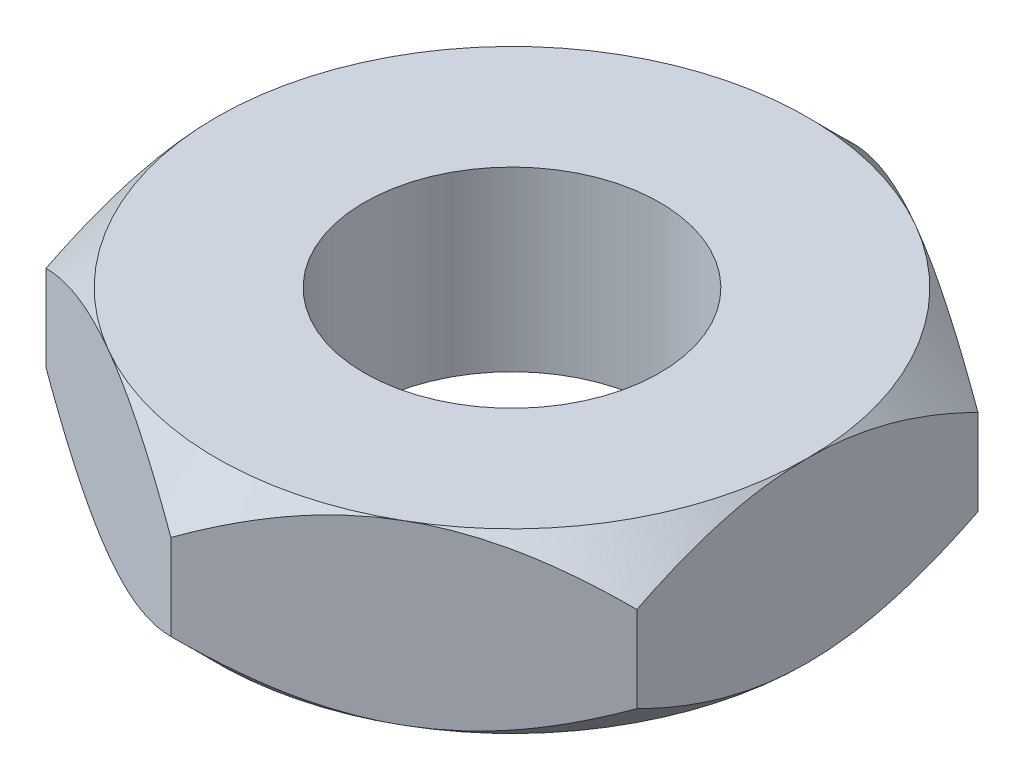
ISO-10303-21;
HEADER;
FILE_DESCRIPTION(('STEP AP214'),'2;1');
FILE_NAME('part.step','',(''),(''),'','','');
FILE_SCHEMA(('AUTOMOTIVE_DESIGN { 1 0 10303 214 1 1 1 1 }'));
ENDSEC;
DATA;
#1=APPLICATION_CONTEXT('core data for automotive mechanical design processes');
#2=APPLICATION_PROTOCOL_DEFINITION('international standard','automotive_design',2000,#1);
#3=PRODUCT_CONTEXT('',#1,'mechanical');
#4=PRODUCT('Part','Part','',(#3));
#5=PRODUCT_RELATED_PRODUCT_CATEGORY('part','',(#4));
#6=PRODUCT_DEFINITION_FORMATION('','',#4);
#7=PRODUCT_DEFINITION_CONTEXT('part definition',#1,'design');
#8=PRODUCT_DEFINITION('design','',#6,#7);
#9=PRODUCT_DEFINITION_SHAPE('','',#8);
#10=(LENGTH_UNIT() NAMED_UNIT(*) SI_UNIT(.MILLI.,.METRE.));
#11=(NAMED_UNIT(*) PLANE_ANGLE_UNIT() SI_UNIT($,.RADIAN.));
#12=(NAMED_UNIT(*) SI_UNIT($,.STERADIAN.) SOLID_ANGLE_UNIT());
#13=UNCERTAINTY_MEASURE_WITH_UNIT(LENGTH_MEASURE(1.E-05),#10,'distance_accuracy_value','');
#14=(GEOMETRIC_REPRESENTATION_CONTEXT(3) GLOBAL_UNCERTAINTY_ASSIGNED_CONTEXT((#13)) GLOBAL_UNIT_ASSIGNED_CONTEXT((#10,
#11,#12)) REPRESENTATION_CONTEXT('',''));
#15=CARTESIAN_POINT('',(0.,0.,0.));
#16=DIRECTION('',(0.,0.,1.));
#17=DIRECTION('',(1.,0.,0.));
#18=AXIS2_PLACEMENT_3D('',#15,#16,#17);
#19=CARTESIAN_POINT('',(0.,-0.6,0.));
#20=DIRECTION('',(0.,1.,0.));
#21=DIRECTION('',(0.,0.,1.));
#22=AXIS2_PLACEMENT_3D('',#19,#20,#21);
#23=PLANE('',#22);
#24=CARTESIAN_POINT('',(0.,-0.6,0.));
#25=DIRECTION('',(0.,1.,0.));
#26=DIRECTION('',(0.,0.,1.));
#27=AXIS2_PLACEMENT_3D('',#24,#25,#26);
#28=CIRCLE('',#27,1.);
#29=CARTESIAN_POINT('',(0.,-0.6,1.));
#30=VERTEX_POINT('',#29);
#31=EDGE_CURVE('E251',#30,#30,#28,.T.);
#32=ORIENTED_EDGE('',*,*,#31,.T.);
#33=EDGE_LOOP('',(#32));
#34=FACE_BOUND('',#33,.T.);
#35=CARTESIAN_POINT('',(0.,-0.6,0.));
#36=DIRECTION('',(0.,1.,0.));
#37=DIRECTION('',(-1.,0.,0.));
#38=AXIS2_PLACEMENT_3D('',#35,#36,#37);
#39=CIRCLE('',#38,2.);
#40=CARTESIAN_POINT('',(-1.,-0.6,1.73205080756888));
#41=VERTEX_POINT('',#40);
#42=CARTESIAN_POINT('',(0.999999999999999,-0.6,1.73205080756888));
#43=VERTEX_POINT('',#42);
#44=EDGE_CURVE('E164',#41,#43,#39,.T.);
#45=ORIENTED_EDGE('',*,*,#44,.F.);
#46=CARTESIAN_POINT('',(-2.,-0.6,0.));
#47=VERTEX_POINT('',#46);
#48=EDGE_CURVE('E148',#47,#41,#39,.T.);
#49=ORIENTED_EDGE('',*,*,#48,.F.);
#50=CARTESIAN_POINT('',(-1.,-0.6,-1.73205080756888));
#51=VERTEX_POINT('',#50);
#52=EDGE_CURVE('E135',#51,#47,#39,.T.);
#53=ORIENTED_EDGE('',*,*,#52,.F.);
#54=CARTESIAN_POINT('',(1.,-0.6,-1.73205080756888));
#55=VERTEX_POINT('',#54);
#56=EDGE_CURVE('E146',#55,#51,#39,.T.);
#57=ORIENTED_EDGE('',*,*,#56,.F.);
#58=CARTESIAN_POINT('',(2.,-0.6,0.));
#59=VERTEX_POINT('',#58);
#60=EDGE_CURVE('E59',#59,#55,#39,.T.);
#61=ORIENTED_EDGE('',*,*,#60,.F.);
#62=EDGE_CURVE('E169',#43,#59,#39,.T.);
#63=ORIENTED_EDGE('',*,*,#62,.F.);
#64=EDGE_LOOP('',(#45,#49,#53,#57,#61,#63));
#65=FACE_BOUND('',#64,.T.);
#66=ADVANCED_FACE('F37',(#34,#65),#23,.F.);
#67=CARTESIAN_POINT('',(0.,0.6,0.));
#68=DIRECTION('',(0.,1.,0.));
#69=DIRECTION('',(0.,0.,1.));
#70=AXIS2_PLACEMENT_3D('',#67,#68,#69);
#71=PLANE('',#70);
#72=CARTESIAN_POINT('',(0.,0.6,0.));
#73=DIRECTION('',(0.,1.,0.));
#74=DIRECTION('',(0.,0.,1.));
#75=AXIS2_PLACEMENT_3D('',#72,#73,#74);
#76=CIRCLE('',#75,1.);
#77=CARTESIAN_POINT('',(0.,0.6,1.));
#78=VERTEX_POINT('',#77);
#79=EDGE_CURVE('E247',#78,#78,#76,.T.);
#80=ORIENTED_EDGE('',*,*,#79,.F.);
#81=EDGE_LOOP('',(#80));
#82=FACE_BOUND('',#81,.T.);
#83=CARTESIAN_POINT('',(0.,0.6,0.));
#84=DIRECTION('',(0.,1.,0.));
#85=DIRECTION('',(-1.,0.,0.));
#86=AXIS2_PLACEMENT_3D('',#83,#84,#85);
#87=CIRCLE('',#86,2.);
#88=CARTESIAN_POINT('',(-2.,0.6,0.));
#89=VERTEX_POINT('',#88);
#90=CARTESIAN_POINT('',(-1.,0.6,1.73205080756888));
#91=VERTEX_POINT('',#90);
#92=EDGE_CURVE('E302',#89,#91,#87,.T.);
#93=ORIENTED_EDGE('',*,*,#92,.T.);
#94=CARTESIAN_POINT('',(0.999999999999999,0.6,1.73205080756888));
#95=VERTEX_POINT('',#94);
#96=EDGE_CURVE('E304',#91,#95,#87,.T.);
#97=ORIENTED_EDGE('',*,*,#96,.T.);
#98=CARTESIAN_POINT('',(2.,0.6,0.));
#99=VERTEX_POINT('',#98);
#100=EDGE_CURVE('E314',#95,#99,#87,.T.);
#101=ORIENTED_EDGE('',*,*,#100,.T.);
#102=CARTESIAN_POINT('',(1.,0.6,-1.73205080756888));
#103=VERTEX_POINT('',#102);
#104=EDGE_CURVE('E317',#99,#103,#87,.T.);
#105=ORIENTED_EDGE('',*,*,#104,.T.);
#106=CARTESIAN_POINT('',(-1.,0.6,-1.73205080756888));
#107=VERTEX_POINT('',#106);
#108=EDGE_CURVE('E315',#103,#107,#87,.T.);
#109=ORIENTED_EDGE('',*,*,#108,.T.);
#110=EDGE_CURVE('E306',#107,#89,#87,.T.);
#111=ORIENTED_EDGE('',*,*,#110,.T.);
#112=EDGE_LOOP('',(#93,#97,#101,#105,#109,#111));
#113=FACE_BOUND('',#112,.T.);
#114=ADVANCED_FACE('F283',(#82,#113),#71,.T.);
#115=CARTESIAN_POINT('',(2.,0.6,-1.15470053837925));
#116=DIRECTION('',(-0.5,0.,0.866025403784439));
#117=DIRECTION('',(0.866025403784439,0.,0.5));
#118=AXIS2_PLACEMENT_3D('',#115,#116,#117);
#119=PLANE('',#118);
#120=DIRECTION('',(0.,-1.,0.));
#121=VECTOR('',#120,1.);
#122=CARTESIAN_POINT('',(2.,0.6,-1.15470053837925));
#123=LINE('',#122,#121);
#124=CARTESIAN_POINT('',(2.,0.290598923241498,-1.15470053837925));
#125=VERTEX_POINT('',#124);
#126=CARTESIAN_POINT('',(2.,-0.290598923241498,-1.15470053837925));
#127=VERTEX_POINT('',#126);
#128=EDGE_CURVE('E250',#125,#127,#123,.T.);
#129=ORIENTED_EDGE('',*,*,#128,.T.);
#130=CARTESIAN_POINT('',(2.0002,-0.290483444527839,-1.15458506832542));
#131=CARTESIAN_POINT('',(1.93144696596929,-0.330145833015907,-1.19427965103065));
#132=CARTESIAN_POINT('',(1.86154425786449,-0.367478940957337,-1.23463799837204));
#133=CARTESIAN_POINT('',(1.71900475544956,-0.435835238105355,-1.31693321846145));
#134=CARTESIAN_POINT('',(1.64635440243464,-0.466820389504277,-1.35887791933134));
#135=CARTESIAN_POINT('',(1.49985839894603,-0.519898706697355,-1.44345742638069));
#136=CARTESIAN_POINT('',(1.42605006475371,-0.542125296064887,-1.48607068799507));
#137=CARTESIAN_POINT('',(1.27680836816474,-0.576370106566418,-1.57223542169503));
#138=CARTESIAN_POINT('',(1.20137956608185,-0.588413894097364,-1.61578426088223));
#139=CARTESIAN_POINT('',(1.07138449932892,-0.599280411335927,-1.69083694766536));
#140=CARTESIAN_POINT('',(1.01698621602989,-0.600889169631528,-1.72224381117151));
#141=CARTESIAN_POINT('',(0.90827854448031,-0.598180045642787,-1.78500621460364));
#142=CARTESIAN_POINT('',(0.853969194078665,-0.593860085483524,-1.81636173267754));
#143=CARTESIAN_POINT('',(0.745863272410666,-0.579539355831593,-1.87877671565355));
#144=CARTESIAN_POINT('',(0.692067343445212,-0.569532230479493,-1.90983580972306));
#145=CARTESIAN_POINT('',(0.585405737694431,-0.54438649299184,-1.97141691651547));
#146=CARTESIAN_POINT('',(0.532539989929292,-0.52924827419926,-2.00193897021859));
#147=CARTESIAN_POINT('',(0.39712026691016,-0.484304419812309,-2.08012358375727));
#148=CARTESIAN_POINT('',(0.315406165150525,-0.451110083815683,-2.12730124240478));
#149=CARTESIAN_POINT('',(0.195252962742199,-0.395073100070129,-2.19667172615922));
#150=CARTESIAN_POINT('',(0.155657147890824,-0.375384220294558,-2.21953238052245));
#151=CARTESIAN_POINT('',(0.0771990411121284,-0.334211604876626,-2.26483018959124));
#152=CARTESIAN_POINT('',(0.03833631640626,-0.31272897159025,-2.28726759416161));
#153=CARTESIAN_POINT('',(-0.000199999999999924,-0.290483444527838,-2.30951654681234));
#154=B_SPLINE_CURVE_WITH_KNOTS('',3,(#130,#131,#132,#133,#134,#135,#136,#137,#138,#139,#140,
#141,#142,#143,#144,#145,#146,#147,#148,#149,#150,#151,#152,#153),.UNSPECIFIED.,.F.,.F.,(4,2,2,
2,2,2,2,2,2,2,2,4),(0.,0.266420613771062,0.534393751523386,0.798110374376911,1.06116288956936,
1.24939906803721,1.43770123566247,1.62621426093931,1.81471283831912,2.11415604834144,
2.2634717071779,2.41269626969771),.UNSPECIFIED.);
#155=EDGE_CURVE('E316',#127,#55,#154,.T.);
#156=ORIENTED_EDGE('',*,*,#155,.T.);
#157=CARTESIAN_POINT('',(0.,-0.290598923241497,-2.3094010767585));
#158=VERTEX_POINT('',#157);
#159=EDGE_CURVE('E211',#55,#158,#154,.T.);
#160=ORIENTED_EDGE('',*,*,#159,.T.);
#161=DIRECTION('',(0.,-1.,0.));
#162=VECTOR('',#161,1.);
#163=CARTESIAN_POINT('',(0.,0.6,-2.3094010767585));
#164=LINE('',#163,#162);
#165=CARTESIAN_POINT('',(0.,0.290598923241497,-2.3094010767585));
#166=VERTEX_POINT('',#165);
#167=EDGE_CURVE('E265',#166,#158,#164,.T.);
#168=ORIENTED_EDGE('',*,*,#167,.F.);
#169=CARTESIAN_POINT('',(-0.0002,0.290483444527838,-2.30951654681234));
#170=CARTESIAN_POINT('',(0.0685530340307054,0.330145833015905,-2.26982196410711));
#171=CARTESIAN_POINT('',(0.138455742135511,0.367478940957335,-2.22946361676572));
#172=CARTESIAN_POINT('',(0.280995244550436,0.435835238105354,-2.14716839667631));
#173=CARTESIAN_POINT('',(0.353645597565357,0.466820389504277,-2.10522369580642));
#174=CARTESIAN_POINT('',(0.50014160105397,0.519898706697355,-2.02064418875706));
#175=CARTESIAN_POINT('',(0.573949935246293,0.542125296064887,-1.97803092714269));
#176=CARTESIAN_POINT('',(0.723191631835262,0.576370106566417,-1.89186619344273));
#177=CARTESIAN_POINT('',(0.79862043391815,0.588413894097364,-1.84831735425552));
#178=CARTESIAN_POINT('',(0.928615500671077,0.599280411335927,-1.7732646674724));
#179=CARTESIAN_POINT('',(0.983013783970106,0.600889169631528,-1.74185780396625));
#180=CARTESIAN_POINT('',(1.09172145551969,0.598180045642787,-1.67909540053412));
#181=CARTESIAN_POINT('',(1.14603080592134,0.593860085483524,-1.64773988246022));
#182=CARTESIAN_POINT('',(1.25413672758933,0.579539355831593,-1.58532489948421));
#183=CARTESIAN_POINT('',(1.30793265655479,0.569532230479493,-1.55426580541469));
#184=CARTESIAN_POINT('',(1.41459426230557,0.54438649299184,-1.49268469862228));
#185=CARTESIAN_POINT('',(1.46746001007071,0.52924827419926,-1.46216264491917));
#186=CARTESIAN_POINT('',(1.60287973308984,0.48430441981231,-1.38397803138049));
#187=CARTESIAN_POINT('',(1.68459383484948,0.451110083815684,-1.33680037273298));
#188=CARTESIAN_POINT('',(1.8047470372578,0.39507310007013,-1.26742988897853));
#189=CARTESIAN_POINT('',(1.84434285210917,0.375384220294559,-1.24456923461531));
#190=CARTESIAN_POINT('',(1.92280095888787,0.334211604876628,-1.19927142554652));
#191=CARTESIAN_POINT('',(1.96166368359374,0.312728971590252,-1.17683402097615));
#192=CARTESIAN_POINT('',(2.0002,0.290483444527839,-1.15458506832542));
#193=B_SPLINE_CURVE_WITH_KNOTS('',3,(#169,#170,#171,#172,#173,#174,#175,#176,#177,#178,#179,
#180,#181,#182,#183,#184,#185,#186,#187,#188,#189,#190,#191,#192),.UNSPECIFIED.,.F.,.F.,(4,2,2,
2,2,2,2,2,2,2,2,4),(0.,0.266420613771063,0.534393751523387,0.798110374376912,1.06116288956936,
1.24939906803721,1.43770123566247,1.62621426093931,1.81471283831913,2.11415604834144,
2.2634717071779,2.41269626969771),.UNSPECIFIED.);
#194=EDGE_CURVE('E488',#166,#103,#193,.T.);
#195=ORIENTED_EDGE('',*,*,#194,.T.);
#196=EDGE_CURVE('E311',#103,#125,#193,.T.);
#197=ORIENTED_EDGE('',*,*,#196,.T.);
#198=EDGE_LOOP('',(#129,#156,#160,#168,#195,#197));
#199=FACE_BOUND('',#198,.T.);
#200=ADVANCED_FACE('F39',(#199),#119,.F.);
#201=CARTESIAN_POINT('',(0.,0.6,-2.3094010767585));
#202=DIRECTION('',(0.5,0.,0.866025403784439));
#203=DIRECTION('',(0.866025403784439,0.,-0.5));
#204=AXIS2_PLACEMENT_3D('',#201,#202,#203);
#205=PLANE('',#204);
#206=ORIENTED_EDGE('',*,*,#167,.T.);
#207=CARTESIAN_POINT('',(0.000200000000000061,-0.290483444527838,-2.30951654681234));
#208=CARTESIAN_POINT('',(-0.0685530340307052,-0.330145833015905,-2.26982196410711));
#209=CARTESIAN_POINT('',(-0.138455742135511,-0.367478940957336,-2.22946361676572));
#210=CARTESIAN_POINT('',(-0.280995244550436,-0.435835238105354,-2.14716839667631));
#211=CARTESIAN_POINT('',(-0.353645597565358,-0.466820389504277,-2.10522369580642));
#212=CARTESIAN_POINT('',(-0.50014160105397,-0.519898706697355,-2.02064418875706));
#213=CARTESIAN_POINT('',(-0.573949935246293,-0.542125296064887,-1.97803092714269));
#214=CARTESIAN_POINT('',(-0.723191631835262,-0.576370106566417,-1.89186619344273));
#215=CARTESIAN_POINT('',(-0.79862043391815,-0.588413894097363,-1.84831735425552));
#216=CARTESIAN_POINT('',(-0.928615500671077,-0.599280411335926,-1.7732646674724));
#217=CARTESIAN_POINT('',(-0.983013783970106,-0.600889169631528,-1.74185780396625));
#218=CARTESIAN_POINT('',(-1.09172145551969,-0.598180045642787,-1.67909540053412));
#219=CARTESIAN_POINT('',(-1.14603080592134,-0.593860085483524,-1.64773988246022));
#220=CARTESIAN_POINT('',(-1.25413672758933,-0.579539355831593,-1.58532489948421));
#221=CARTESIAN_POINT('',(-1.30793265655479,-0.569532230479493,-1.55426580541469));
#222=CARTESIAN_POINT('',(-1.41459426230557,-0.54438649299184,-1.49268469862228));
#223=CARTESIAN_POINT('',(-1.46746001007071,-0.52924827419926,-1.46216264491917));
#224=CARTESIAN_POINT('',(-1.60287973308984,-0.484304419812309,-1.38397803138049));
#225=CARTESIAN_POINT('',(-1.68459383484948,-0.451110083815683,-1.33680037273298));
#226=CARTESIAN_POINT('',(-1.8047470372578,-0.395073100070128,-1.26742988897853));
#227=CARTESIAN_POINT('',(-1.84434285210918,-0.375384220294558,-1.24456923461531));
#228=CARTESIAN_POINT('',(-1.92280095888787,-0.334211604876626,-1.19927142554652));
#229=CARTESIAN_POINT('',(-1.96166368359374,-0.312728971590251,-1.17683402097615));
#230=CARTESIAN_POINT('',(-2.0002,-0.290483444527837,-1.15458506832541));
#231=B_SPLINE_CURVE_WITH_KNOTS('',3,(#207,#208,#209,#210,#211,#212,#213,#214,#215,#216,#217,
#218,#219,#220,#221,#222,#223,#224,#225,#226,#227,#228,#229,#230),.UNSPECIFIED.,.F.,.F.,(4,2,2,
2,2,2,2,2,2,2,2,4),(0.,0.266420613771063,0.534393751523387,0.798110374376913,1.06116288956936,
1.24939906803721,1.43770123566247,1.62621426093931,1.81471283831913,2.11415604834144,
2.2634717071779,2.41269626969771),.UNSPECIFIED.);
#232=EDGE_CURVE('E210',#158,#51,#231,.T.);
#233=ORIENTED_EDGE('',*,*,#232,.T.);
#234=CARTESIAN_POINT('',(-2.,-0.290598923241496,-1.15470053837925));
#235=VERTEX_POINT('',#234);
#236=EDGE_CURVE('E141',#51,#235,#231,.T.);
#237=ORIENTED_EDGE('',*,*,#236,.T.);
#238=DIRECTION('',(0.,-1.,0.));
#239=VECTOR('',#238,1.);
#240=CARTESIAN_POINT('',(-2.,0.6,-1.15470053837925));
#241=LINE('',#240,#239);
#242=CARTESIAN_POINT('',(-2.,0.290598923241496,-1.15470053837925));
#243=VERTEX_POINT('',#242);
#244=EDGE_CURVE('E162',#243,#235,#241,.T.);
#245=ORIENTED_EDGE('',*,*,#244,.F.);
#246=CARTESIAN_POINT('',(-2.0002,0.290483444527837,-1.15458506832541));
#247=CARTESIAN_POINT('',(-1.9314469659693,0.330145833015905,-1.19427965103065));
#248=CARTESIAN_POINT('',(-1.86154425786449,0.367478940957335,-1.23463799837204));
#249=CARTESIAN_POINT('',(-1.71900475544957,0.435835238105354,-1.31693321846145));
#250=CARTESIAN_POINT('',(-1.64635440243464,0.466820389504277,-1.35887791933134));
#251=CARTESIAN_POINT('',(-1.49985839894603,0.519898706697355,-1.44345742638069));
#252=CARTESIAN_POINT('',(-1.42605006475371,0.542125296064887,-1.48607068799507));
#253=CARTESIAN_POINT('',(-1.27680836816474,0.576370106566417,-1.57223542169503));
#254=CARTESIAN_POINT('',(-1.20137956608185,0.588413894097363,-1.61578426088223));
#255=CARTESIAN_POINT('',(-1.07138449932892,0.599280411335926,-1.69083694766536));
#256=CARTESIAN_POINT('',(-1.01698621602989,0.600889169631528,-1.72224381117151));
#257=CARTESIAN_POINT('',(-0.908278544480309,0.598180045642787,-1.78500621460364));
#258=CARTESIAN_POINT('',(-0.853969194078664,0.593860085483524,-1.81636173267754));
#259=CARTESIAN_POINT('',(-0.745863272410665,0.579539355831593,-1.87877671565355));
#260=CARTESIAN_POINT('',(-0.692067343445211,0.569532230479492,-1.90983580972306));
#261=CARTESIAN_POINT('',(-0.58540573769443,0.54438649299184,-1.97141691651547));
#262=CARTESIAN_POINT('',(-0.532539989929292,0.529248274199259,-2.00193897021859));
#263=CARTESIAN_POINT('',(-0.397120266910159,0.484304419812309,-2.08012358375727));
#264=CARTESIAN_POINT('',(-0.315406165150524,0.451110083815683,-2.12730124240478));
#265=CARTESIAN_POINT('',(-0.195252962742199,0.395073100070129,-2.19667172615922));
#266=CARTESIAN_POINT('',(-0.155657147890824,0.375384220294558,-2.21953238052245));
#267=CARTESIAN_POINT('',(-0.0771990411121282,0.334211604876626,-2.26483018959124));
#268=CARTESIAN_POINT('',(-0.0383363164062599,0.312728971590251,-2.28726759416161));
#269=CARTESIAN_POINT('',(0.000200000000000082,0.290483444527838,-2.30951654681234));
#270=B_SPLINE_CURVE_WITH_KNOTS('',3,(#246,#247,#248,#249,#250,#251,#252,#253,#254,#255,#256,
#257,#258,#259,#260,#261,#262,#263,#264,#265,#266,#267,#268,#269),.UNSPECIFIED.,.F.,.F.,(4,2,2,
2,2,2,2,2,2,2,2,4),(0.,0.266420613771063,0.534393751523388,0.798110374376913,1.06116288956936,
1.24939906803721,1.43770123566247,1.62621426093931,1.81471283831913,2.11415604834145,
2.26347170717791,2.41269626969771),.UNSPECIFIED.);
#271=EDGE_CURVE('E232',#243,#107,#270,.T.);
#272=ORIENTED_EDGE('',*,*,#271,.T.);
#273=EDGE_CURVE('E224',#107,#166,#270,.T.);
#274=ORIENTED_EDGE('',*,*,#273,.T.);
#275=EDGE_LOOP('',(#206,#233,#237,#245,#272,#274));
#276=FACE_BOUND('',#275,.T.);
#277=ADVANCED_FACE('F217',(#276),#205,.F.);
#278=CARTESIAN_POINT('',(-2.,0.6,-1.15470053837925));
#279=DIRECTION('',(1.,0.,0.));
#280=DIRECTION('',(0.,0.,-1.));
#281=AXIS2_PLACEMENT_3D('',#278,#279,#280);
#282=PLANE('',#281);
#283=ORIENTED_EDGE('',*,*,#244,.T.);
#284=CARTESIAN_POINT('',(-2.,1.44660049892774,-3.51780835150556));
#285=CARTESIAN_POINT('',(-2.,1.35633545480338,-3.4139345116189));
#286=CARTESIAN_POINT('',(-2.,1.26658419325914,-3.30960491746731));
#287=CARTESIAN_POINT('',(-2.,1.0884758173122,-3.09967990012628));
#288=CARTESIAN_POINT('',(-2.,1.00011937533331,-2.99408390713831));
#289=CARTESIAN_POINT('',(-2.,0.823300975600661,-2.77899453825182));
#290=CARTESIAN_POINT('',(-2.,0.734880681292233,-2.66946677903041));
#291=CARTESIAN_POINT('',(-2.,0.560675360874649,-2.44836951178693));
#292=CARTESIAN_POINT('',(-2.,0.474889682970528,-2.33680051983729));
#293=CARTESIAN_POINT('',(-2.,0.306845435256085,-2.11080052612119));
#294=CARTESIAN_POINT('',(-2.,0.224591465017628,-1.99636608210072));
#295=CARTESIAN_POINT('',(-2.,0.065267699624535,-1.76376073489722));
#296=CARTESIAN_POINT('',(-2.,-0.0117978734378841,-1.64558690100855));
#297=CARTESIAN_POINT('',(-2.,-0.157514981910899,-1.40528399303271));
#298=CARTESIAN_POINT('',(-2.,-0.226224060031875,-1.2831902668145));
#299=CARTESIAN_POINT('',(-2.,-0.351589627561633,-1.03297173542377));
#300=CARTESIAN_POINT('',(-2.,-0.408267982746248,-0.904858397765737));
#301=CARTESIAN_POINT('',(-2.,-0.479924443557588,-0.706139491815754));
#302=CARTESIAN_POINT('',(-2.,-0.501747570356134,-0.638014674767849));
#303=CARTESIAN_POINT('',(-2.,-0.539482708360953,-0.500126615146469));
#304=CARTESIAN_POINT('',(-2.,-0.555395660674832,-0.430363635308766));
#305=CARTESIAN_POINT('',(-2.,-0.58024792522351,-0.29004829941457));
#306=CARTESIAN_POINT('',(-2.,-0.589231656434933,-0.219503962378288));
#307=CARTESIAN_POINT('',(-2.,-0.599730623535876,-0.0778570852278749));
#308=CARTESIAN_POINT('',(-2.,-0.601246747381592,-0.00675461248748182));
#309=CARTESIAN_POINT('',(-2.,-0.596687138879518,0.135336116053154));
#310=CARTESIAN_POINT('',(-2.,-0.590596978297835,0.206323898250636));
#311=CARTESIAN_POINT('',(-2.,-0.571270568456236,0.347312907627164));
#312=CARTESIAN_POINT('',(-2.,-0.558032866760425,0.417313931321538));
#313=CARTESIAN_POINT('',(-2.,-0.525177950329333,0.556315109209948));
#314=CARTESIAN_POINT('',(-2.,-0.50551486203721,0.62530422390651));
#315=CARTESIAN_POINT('',(-2.,-0.460894854359054,0.761521897584209));
#316=CARTESIAN_POINT('',(-2.,-0.435937824414415,0.828750419764208));
#317=CARTESIAN_POINT('',(-2.,-0.37604585882821,0.975370133916498));
#318=CARTESIAN_POINT('',(-2.,-0.340116147184565,1.05435137408536));
#319=CARTESIAN_POINT('',(-2.,-0.26345626796406,1.20996895354261));
#320=CARTESIAN_POINT('',(-2.,-0.222723355180706,1.28660392002545));
#321=CARTESIAN_POINT('',(-2.,-0.137520892741945,1.43795765037448));
#322=CARTESIAN_POINT('',(-2.,-0.0930438513745066,1.5126721622257));
#323=CARTESIAN_POINT('',(-2.,-0.00128224073946037,1.66032422213111));
#324=CARTESIAN_POINT('',(-2.,0.0460017767675139,1.73326211546172));
#325=CARTESIAN_POINT('',(-2.,0.14302243934878,1.87805095401499));
#326=CARTESIAN_POINT('',(-2.,0.192770919991859,1.94989393160597));
#327=CARTESIAN_POINT('',(-2.,0.294022529348655,2.09233561836816));
#328=CARTESIAN_POINT('',(-2.,0.345525790481341,2.16293423302477));
#329=CARTESIAN_POINT('',(-2.,0.501996134507537,2.37300510038412));
#330=CARTESIAN_POINT('',(-2.,0.609042896554844,2.51092629513301));
#331=CARTESIAN_POINT('',(-2.,0.836613747941552,2.79612577791961));
#332=CARTESIAN_POINT('',(-2.,0.957482677736062,2.94312626884009));
#333=CARTESIAN_POINT('',(-2.,1.14031475178092,3.16092870375757));
#334=CARTESIAN_POINT('',(-2.,1.20115949273262,3.23267494510208));
#335=CARTESIAN_POINT('',(-2.,1.32345153116278,3.37562403970102));
#336=CARTESIAN_POINT('',(-2.,1.38489868842542,3.44682701285084));
#337=CARTESIAN_POINT('',(-2.,1.44660049892774,3.51780835150555));
#338=B_SPLINE_CURVE_WITH_KNOTS('',3,(#284,#285,#286,#287,#288,#289,#290,#291,#292,#293,#294,
#295,#296,#297,#298,#299,#300,#301,#302,#303,#304,#305,#306,#307,#308,#309,#310,#311,#312,#313,
#314,#315,#316,#317,#318,#319,#320,#321,#322,#323,#324,#325,#326,#327,#328,#329,#330,#331,#332,
#333,#334,#335,#336,#337),.UNSPECIFIED.,.F.,.F.,(4,2,2,2,2,2,2,2,2,2,2,2,2,2,2,2,2,2,2,2,2,2,2,
2,2,2,4),(0.,0.41285013760849,0.825893574338906,1.24815624097891,1.67031358571966,
2.09300501629884,2.51603635798438,2.93596638845078,3.35512653644645,3.56951875894449,
3.78387682801032,3.99684908815923,4.20979602364999,4.42314750881825,4.63654236499184,
4.85149529850702,5.06645272153845,5.32654230351972,5.58678126341899,5.84755391633439,
6.10827547843788,6.37040093518298,6.63254621639994,7.15620490365787,7.72708662506731,
8.0093009816319,8.29145114109918),.UNSPECIFIED.);
#339=EDGE_CURVE('E139',#235,#47,#338,.T.);
#340=ORIENTED_EDGE('',*,*,#339,.T.);
#341=CARTESIAN_POINT('',(-2.,-0.290598923241498,1.15470053837925));
#342=VERTEX_POINT('',#341);
#343=EDGE_CURVE('E152',#47,#342,#338,.T.);
#344=ORIENTED_EDGE('',*,*,#343,.T.);
#345=DIRECTION('',(0.,-1.,0.));
#346=VECTOR('',#345,1.);
#347=CARTESIAN_POINT('',(-2.,0.6,1.15470053837925));
#348=LINE('',#347,#346);
#349=CARTESIAN_POINT('',(-2.,0.290598923241498,1.15470053837925));
#350=VERTEX_POINT('',#349);
#351=EDGE_CURVE('E262',#350,#342,#348,.T.);
#352=ORIENTED_EDGE('',*,*,#351,.F.);
#353=CARTESIAN_POINT('',(-2.,-1.44660049892774,3.51780835150555));
#354=CARTESIAN_POINT('',(-2.,-1.35633545480338,3.4139345116189));
#355=CARTESIAN_POINT('',(-2.,-1.26658419325913,3.30960491746731));
#356=CARTESIAN_POINT('',(-2.,-1.0884758173122,3.09967990012628));
#357=CARTESIAN_POINT('',(-2.,-1.00011937533331,2.99408390713831));
#358=CARTESIAN_POINT('',(-2.,-0.823300975600659,2.77899453825182));
#359=CARTESIAN_POINT('',(-2.,-0.734880681292232,2.6694667790304));
#360=CARTESIAN_POINT('',(-2.,-0.560675360874648,2.44836951178693));
#361=CARTESIAN_POINT('',(-2.,-0.474889682970527,2.33680051983729));
#362=CARTESIAN_POINT('',(-2.,-0.306845435256083,2.11080052612119));
#363=CARTESIAN_POINT('',(-2.,-0.224591465017627,1.99636608210072));
#364=CARTESIAN_POINT('',(-2.,-0.0652676996245338,1.76376073489722));
#365=CARTESIAN_POINT('',(-2.,0.0117978734378852,1.64558690100854));
#366=CARTESIAN_POINT('',(-2.,0.1575149819109,1.40528399303271));
#367=CARTESIAN_POINT('',(-2.,0.226224060031876,1.2831902668145));
#368=CARTESIAN_POINT('',(-2.,0.351589627561633,1.03297173542377));
#369=CARTESIAN_POINT('',(-2.,0.408267982746248,0.904858397765737));
#370=CARTESIAN_POINT('',(-2.,0.479924443557589,0.706139491815753));
#371=CARTESIAN_POINT('',(-2.,0.501747570356134,0.638014674767848));
#372=CARTESIAN_POINT('',(-2.,0.539482708360953,0.500126615146468));
#373=CARTESIAN_POINT('',(-2.,0.555395660674832,0.430363635308765));
#374=CARTESIAN_POINT('',(-2.,0.58024792522351,0.290048299414569));
#375=CARTESIAN_POINT('',(-2.,0.589231656434933,0.219503962378287));
#376=CARTESIAN_POINT('',(-2.,0.599730623535877,0.0778570852278741));
#377=CARTESIAN_POINT('',(-2.,0.601246747381592,0.00675461248748099));
#378=CARTESIAN_POINT('',(-2.,0.596687138879518,-0.135336116053155));
#379=CARTESIAN_POINT('',(-2.,0.590596978297835,-0.206323898250637));
#380=CARTESIAN_POINT('',(-2.,0.571270568456236,-0.347312907627165));
#381=CARTESIAN_POINT('',(-2.,0.558032866760425,-0.417313931321539));
#382=CARTESIAN_POINT('',(-2.,0.525177950329333,-0.556315109209949));
#383=CARTESIAN_POINT('',(-2.,0.50551486203721,-0.625304223906511));
#384=CARTESIAN_POINT('',(-2.,0.460894854359054,-0.76152189758421));
#385=CARTESIAN_POINT('',(-2.,0.435937824414414,-0.828750419764209));
#386=CARTESIAN_POINT('',(-2.,0.376045858828209,-0.975370133916499));
#387=CARTESIAN_POINT('',(-2.,0.340116147184565,-1.05435137408537));
#388=CARTESIAN_POINT('',(-2.,0.26345626796406,-1.20996895354261));
#389=CARTESIAN_POINT('',(-2.,0.222723355180706,-1.28660392002545));
#390=CARTESIAN_POINT('',(-2.,0.137520892741944,-1.43795765037448));
#391=CARTESIAN_POINT('',(-2.,0.0930438513745059,-1.5126721622257));
#392=CARTESIAN_POINT('',(-2.,0.00128224073945946,-1.66032422213111));
#393=CARTESIAN_POINT('',(-2.,-0.0460017767675148,-1.73326211546173));
#394=CARTESIAN_POINT('',(-2.,-0.143022439348781,-1.87805095401499));
#395=CARTESIAN_POINT('',(-2.,-0.19277091999186,-1.94989393160597));
#396=CARTESIAN_POINT('',(-2.,-0.294022529348656,-2.09233561836816));
#397=CARTESIAN_POINT('',(-2.,-0.345525790481342,-2.16293423302478));
#398=CARTESIAN_POINT('',(-2.,-0.501996134507539,-2.37300510038413));
#399=CARTESIAN_POINT('',(-2.,-0.609042896554846,-2.51092629513301));
#400=CARTESIAN_POINT('',(-2.,-0.836613747941554,-2.79612577791961));
#401=CARTESIAN_POINT('',(-2.,-0.957482677736064,-2.94312626884009));
#402=CARTESIAN_POINT('',(-2.,-1.14031475178092,-3.16092870375757));
#403=CARTESIAN_POINT('',(-2.,-1.20115949273262,-3.23267494510208));
#404=CARTESIAN_POINT('',(-2.,-1.32345153116278,-3.37562403970102));
#405=CARTESIAN_POINT('',(-2.,-1.38489868842542,-3.44682701285084));
#406=CARTESIAN_POINT('',(-2.,-1.44660049892774,-3.51780835150556));
#407=B_SPLINE_CURVE_WITH_KNOTS('',3,(#353,#354,#355,#356,#357,#358,#359,#360,#361,#362,#363,
#364,#365,#366,#367,#368,#369,#370,#371,#372,#373,#374,#375,#376,#377,#378,#379,#380,#381,#382,
#383,#384,#385,#386,#387,#388,#389,#390,#391,#392,#393,#394,#395,#396,#397,#398,#399,#400,#401,
#402,#403,#404,#405,#406),.UNSPECIFIED.,.F.,.F.,(4,2,2,2,2,2,2,2,2,2,2,2,2,2,2,2,2,2,2,2,2,2,2,
2,2,2,4),(0.,0.41285013760849,0.825893574338906,1.2481562409789,1.67031358571966,
2.09300501629884,2.51603635798438,2.93596638845078,3.35512653644645,3.56951875894449,
3.78387682801032,3.99684908815923,4.20979602364999,4.42314750881825,4.63654236499184,
4.85149529850701,5.06645272153845,5.32654230351971,5.58678126341898,5.84755391633439,
6.10827547843788,6.37040093518298,6.63254621639994,7.15620490365787,7.72708662506731,
8.0093009816319,8.29145114109918),.UNSPECIFIED.);
#408=EDGE_CURVE('E245',#350,#89,#407,.T.);
#409=ORIENTED_EDGE('',*,*,#408,.T.);
#410=EDGE_CURVE('E239',#89,#243,#407,.T.);
#411=ORIENTED_EDGE('',*,*,#410,.T.);
#412=EDGE_LOOP('',(#283,#340,#344,#352,#409,#411));
#413=FACE_BOUND('',#412,.T.);
#414=ADVANCED_FACE('F159',(#413),#282,.F.);
#415=CARTESIAN_POINT('',(-2.,0.6,1.15470053837925));
#416=DIRECTION('',(0.5,0.,-0.866025403784438));
#417=DIRECTION('',(-0.866025403784439,0.,-0.5));
#418=AXIS2_PLACEMENT_3D('',#415,#416,#417);
#419=PLANE('',#418);
#420=ORIENTED_EDGE('',*,*,#351,.T.);
#421=CARTESIAN_POINT('',(-2.0002,-0.290483444527838,1.15458506832541));
#422=CARTESIAN_POINT('',(-1.9314469659693,-0.330145833015906,1.19427965103064));
#423=CARTESIAN_POINT('',(-1.86154425786449,-0.367478940957336,1.23463799837204));
#424=CARTESIAN_POINT('',(-1.71900475544957,-0.435835238105355,1.31693321846145));
#425=CARTESIAN_POINT('',(-1.64635440243464,-0.466820389504278,1.35887791933134));
#426=CARTESIAN_POINT('',(-1.49985839894603,-0.519898706697356,1.44345742638069));
#427=CARTESIAN_POINT('',(-1.42605006475371,-0.542125296064888,1.48607068799507));
#428=CARTESIAN_POINT('',(-1.27680836816474,-0.576370106566419,1.57223542169502));
#429=CARTESIAN_POINT('',(-1.20137956608185,-0.588413894097364,1.61578426088223));
#430=CARTESIAN_POINT('',(-1.07138449932892,-0.599280411335928,1.69083694766536));
#431=CARTESIAN_POINT('',(-1.01698621602989,-0.600889169631529,1.7222438111715));
#432=CARTESIAN_POINT('',(-0.90827854448031,-0.598180045642788,1.78500621460363));
#433=CARTESIAN_POINT('',(-0.853969194078665,-0.593860085483526,1.81636173267754));
#434=CARTESIAN_POINT('',(-0.745863272410666,-0.579539355831594,1.87877671565355));
#435=CARTESIAN_POINT('',(-0.692067343445212,-0.569532230479494,1.90983580972306));
#436=CARTESIAN_POINT('',(-0.585405737694432,-0.544386492991842,1.97141691651547));
#437=CARTESIAN_POINT('',(-0.532539989929293,-0.529248274199261,2.00193897021859));
#438=CARTESIAN_POINT('',(-0.39712026691016,-0.484304419812311,2.08012358375727));
#439=CARTESIAN_POINT('',(-0.315406165150525,-0.451110083815685,2.12730124240478));
#440=CARTESIAN_POINT('',(-0.1952529627422,-0.39507310007013,2.19667172615922));
#441=CARTESIAN_POINT('',(-0.155657147890825,-0.37538422029456,2.21953238052245));
#442=CARTESIAN_POINT('',(-0.0771990411121292,-0.334211604876628,2.26483018959123));
#443=CARTESIAN_POINT('',(-0.0383363164062609,-0.312728971590252,2.28726759416161));
#444=CARTESIAN_POINT('',(0.000199999999999093,-0.290483444527839,2.30951654681234));
#445=B_SPLINE_CURVE_WITH_KNOTS('',3,(#421,#422,#423,#424,#425,#426,#427,#428,#429,#430,#431,
#432,#433,#434,#435,#436,#437,#438,#439,#440,#441,#442,#443,#444),.UNSPECIFIED.,.F.,.F.,(4,2,2,
2,2,2,2,2,2,2,2,4),(0.,0.266420613771063,0.534393751523387,0.798110374376913,1.06116288956936,
1.24939906803721,1.43770123566247,1.62621426093931,1.81471283831913,2.11415604834144,
2.2634717071779,2.41269626969771),.UNSPECIFIED.);
#446=EDGE_CURVE('E67',#342,#41,#445,.T.);
#447=ORIENTED_EDGE('',*,*,#446,.T.);
#448=CARTESIAN_POINT('',(0.,-0.290598923241498,2.3094010767585));
#449=VERTEX_POINT('',#448);
#450=EDGE_CURVE('E176',#41,#449,#445,.T.);
#451=ORIENTED_EDGE('',*,*,#450,.T.);
#452=DIRECTION('',(0.,-1.,0.));
#453=VECTOR('',#452,1.);
#454=CARTESIAN_POINT('',(0.,0.6,2.3094010767585));
#455=LINE('',#454,#453);
#456=CARTESIAN_POINT('',(0.,0.290598923241498,2.3094010767585));
#457=VERTEX_POINT('',#456);
#458=EDGE_CURVE('E259',#457,#449,#455,.T.);
#459=ORIENTED_EDGE('',*,*,#458,.F.);
#460=CARTESIAN_POINT('',(0.000199999999999361,0.290483444527839,2.30951654681234));
#461=CARTESIAN_POINT('',(-0.068553034030706,0.330145833015907,2.26982196410711));
#462=CARTESIAN_POINT('',(-0.138455742135512,0.367478940957337,2.22946361676572));
#463=CARTESIAN_POINT('',(-0.280995244550436,0.435835238105356,2.1471683966763));
#464=CARTESIAN_POINT('',(-0.353645597565358,0.466820389504278,2.10522369580642));
#465=CARTESIAN_POINT('',(-0.50014160105397,0.519898706697356,2.02064418875706));
#466=CARTESIAN_POINT('',(-0.573949935246293,0.542125296064888,1.97803092714269));
#467=CARTESIAN_POINT('',(-0.723191631835262,0.576370106566419,1.89186619344273));
#468=CARTESIAN_POINT('',(-0.79862043391815,0.588413894097365,1.84831735425552));
#469=CARTESIAN_POINT('',(-0.928615500671077,0.599280411335928,1.7732646674724));
#470=CARTESIAN_POINT('',(-0.983013783970106,0.600889169631529,1.74185780396625));
#471=CARTESIAN_POINT('',(-1.09172145551969,0.598180045642789,1.67909540053412));
#472=CARTESIAN_POINT('',(-1.14603080592134,0.593860085483526,1.64773988246022));
#473=CARTESIAN_POINT('',(-1.25413672758933,0.579539355831595,1.5853248994842));
#474=CARTESIAN_POINT('',(-1.30793265655479,0.569532230479494,1.55426580541469));
#475=CARTESIAN_POINT('',(-1.41459426230557,0.544386492991842,1.49268469862228));
#476=CARTESIAN_POINT('',(-1.46746001007071,0.529248274199261,1.46216264491917));
#477=CARTESIAN_POINT('',(-1.60287973308984,0.484304419812311,1.38397803138049));
#478=CARTESIAN_POINT('',(-1.68459383484948,0.451110083815685,1.33680037273297));
#479=CARTESIAN_POINT('',(-1.8047470372578,0.39507310007013,1.26742988897853));
#480=CARTESIAN_POINT('',(-1.84434285210918,0.375384220294559,1.24456923461531));
#481=CARTESIAN_POINT('',(-1.92280095888787,0.334211604876627,1.19927142554652));
#482=CARTESIAN_POINT('',(-1.96166368359374,0.312728971590252,1.17683402097614));
#483=CARTESIAN_POINT('',(-2.0002,0.290483444527839,1.15458506832541));
#484=B_SPLINE_CURVE_WITH_KNOTS('',3,(#460,#461,#462,#463,#464,#465,#466,#467,#468,#469,#470,
#471,#472,#473,#474,#475,#476,#477,#478,#479,#480,#481,#482,#483),.UNSPECIFIED.,.F.,.F.,(4,2,2,
2,2,2,2,2,2,2,2,4),(0.,0.266420613771063,0.534393751523387,0.798110374376912,1.06116288956936,
1.24939906803721,1.43770123566247,1.62621426093931,1.81471283831912,2.11415604834144,
2.2634717071779,2.41269626969771),.UNSPECIFIED.);
#485=EDGE_CURVE('E233',#457,#91,#484,.T.);
#486=ORIENTED_EDGE('',*,*,#485,.T.);
#487=EDGE_CURVE('E246',#91,#350,#484,.T.);
#488=ORIENTED_EDGE('',*,*,#487,.T.);
#489=EDGE_LOOP('',(#420,#447,#451,#459,#486,#488));
#490=FACE_BOUND('',#489,.T.);
#491=ADVANCED_FACE('F336',(#490),#419,.F.);
#492=CARTESIAN_POINT('',(0.,0.6,2.3094010767585));
#493=DIRECTION('',(-0.5,0.,-0.866025403784439));
#494=DIRECTION('',(-0.866025403784439,0.,0.5));
#495=AXIS2_PLACEMENT_3D('',#492,#493,#494);
#496=PLANE('',#495);
#497=ORIENTED_EDGE('',*,*,#458,.T.);
#498=CARTESIAN_POINT('',(-0.000200000000000687,-0.290483444527839,2.30951654681234));
#499=CARTESIAN_POINT('',(0.0685530340307046,-0.330145833015906,2.26982196410711));
#500=CARTESIAN_POINT('',(0.13845574213551,-0.367478940957337,2.22946361676572));
#501=CARTESIAN_POINT('',(0.280995244550435,-0.435835238105355,2.1471683966763));
#502=CARTESIAN_POINT('',(0.353645597565357,-0.466820389504278,2.10522369580642));
#503=CARTESIAN_POINT('',(0.500141601053969,-0.519898706697356,2.02064418875706));
#504=CARTESIAN_POINT('',(0.573949935246292,-0.542125296064888,1.97803092714269));
#505=CARTESIAN_POINT('',(0.723191631835261,-0.576370106566418,1.89186619344273));
#506=CARTESIAN_POINT('',(0.798620433918149,-0.588413894097365,1.84831735425552));
#507=CARTESIAN_POINT('',(0.928615500671076,-0.599280411335928,1.7732646674724));
#508=CARTESIAN_POINT('',(0.983013783970105,-0.600889169631529,1.74185780396625));
#509=CARTESIAN_POINT('',(1.09172145551969,-0.598180045642788,1.67909540053412));
#510=CARTESIAN_POINT('',(1.14603080592133,-0.593860085483525,1.64773988246022));
#511=CARTESIAN_POINT('',(1.25413672758933,-0.579539355831594,1.58532489948421));
#512=CARTESIAN_POINT('',(1.30793265655479,-0.569532230479494,1.55426580541469));
#513=CARTESIAN_POINT('',(1.41459426230557,-0.544386492991842,1.49268469862228));
#514=CARTESIAN_POINT('',(1.46746001007071,-0.529248274199261,1.46216264491917));
#515=CARTESIAN_POINT('',(1.60287973308984,-0.48430441981231,1.38397803138049));
#516=CARTESIAN_POINT('',(1.68459383484947,-0.451110083815684,1.33680037273298));
#517=CARTESIAN_POINT('',(1.8047470372578,-0.39507310007013,1.26742988897853));
#518=CARTESIAN_POINT('',(1.84434285210917,-0.37538422029456,1.24456923461531));
#519=CARTESIAN_POINT('',(1.92280095888787,-0.334211604876628,1.19927142554652));
#520=CARTESIAN_POINT('',(1.96166368359374,-0.312728971590252,1.17683402097615));
#521=CARTESIAN_POINT('',(2.0002,-0.290483444527839,1.15458506832542));
#522=B_SPLINE_CURVE_WITH_KNOTS('',3,(#498,#499,#500,#501,#502,#503,#504,#505,#506,#507,#508,
#509,#510,#511,#512,#513,#514,#515,#516,#517,#518,#519,#520,#521),.UNSPECIFIED.,.F.,.F.,(4,2,2,
2,2,2,2,2,2,2,2,4),(0.,0.266420613771063,0.534393751523387,0.798110374376912,1.06116288956936,
1.24939906803721,1.43770123566247,1.62621426093931,1.81471283831913,2.11415604834144,
2.2634717071779,2.41269626969771),.UNSPECIFIED.);
#523=EDGE_CURVE('E167',#449,#43,#522,.T.);
#524=ORIENTED_EDGE('',*,*,#523,.T.);
#525=CARTESIAN_POINT('',(2.,-0.290598923241498,1.15470053837925));
#526=VERTEX_POINT('',#525);
#527=EDGE_CURVE('E165',#43,#526,#522,.T.);
#528=ORIENTED_EDGE('',*,*,#527,.T.);
#529=DIRECTION('',(0.,-1.,0.));
#530=VECTOR('',#529,1.);
#531=CARTESIAN_POINT('',(2.,0.6,1.15470053837925));
#532=LINE('',#531,#530);
#533=CARTESIAN_POINT('',(2.,0.290598923241498,1.15470053837925));
#534=VERTEX_POINT('',#533);
#535=EDGE_CURVE('E256',#534,#526,#532,.T.);
#536=ORIENTED_EDGE('',*,*,#535,.F.);
#537=CARTESIAN_POINT('',(2.0002,0.290483444527839,1.15458506832542));
#538=CARTESIAN_POINT('',(1.93144696596929,0.330145833015907,1.19427965103065));
#539=CARTESIAN_POINT('',(1.86154425786449,0.367478940957337,1.23463799837204));
#540=CARTESIAN_POINT('',(1.71900475544956,0.435835238105356,1.31693321846145));
#541=CARTESIAN_POINT('',(1.64635440243464,0.466820389504278,1.35887791933134));
#542=CARTESIAN_POINT('',(1.49985839894603,0.519898706697356,1.44345742638069));
#543=CARTESIAN_POINT('',(1.42605006475371,0.542125296064888,1.48607068799507));
#544=CARTESIAN_POINT('',(1.27680836816474,0.576370106566419,1.57223542169503));
#545=CARTESIAN_POINT('',(1.20137956608185,0.588413894097365,1.61578426088223));
#546=CARTESIAN_POINT('',(1.07138449932892,0.599280411335928,1.69083694766536));
#547=CARTESIAN_POINT('',(1.01698621602989,0.600889169631529,1.72224381117151));
#548=CARTESIAN_POINT('',(0.908278544480309,0.598180045642788,1.78500621460364));
#549=CARTESIAN_POINT('',(0.853969194078664,0.593860085483525,1.81636173267754));
#550=CARTESIAN_POINT('',(0.745863272410665,0.579539355831594,1.87877671565355));
#551=CARTESIAN_POINT('',(0.692067343445211,0.569532230479494,1.90983580972306));
#552=CARTESIAN_POINT('',(0.58540573769443,0.544386492991841,1.97141691651547));
#553=CARTESIAN_POINT('',(0.532539989929292,0.529248274199261,2.00193897021859));
#554=CARTESIAN_POINT('',(0.397120266910159,0.48430441981231,2.08012358375727));
#555=CARTESIAN_POINT('',(0.315406165150524,0.451110083815684,2.12730124240478));
#556=CARTESIAN_POINT('',(0.195252962742199,0.39507310007013,2.19667172615922));
#557=CARTESIAN_POINT('',(0.155657147890824,0.375384220294559,2.21953238052245));
#558=CARTESIAN_POINT('',(0.0771990411121278,0.334211604876628,2.26483018959123));
#559=CARTESIAN_POINT('',(0.0383363164062593,0.312728971590252,2.28726759416161));
#560=CARTESIAN_POINT('',(-0.000200000000000582,0.290483444527839,2.30951654681234));
#561=B_SPLINE_CURVE_WITH_KNOTS('',3,(#537,#538,#539,#540,#541,#542,#543,#544,#545,#546,#547,
#548,#549,#550,#551,#552,#553,#554,#555,#556,#557,#558,#559,#560),.UNSPECIFIED.,.F.,.F.,(4,2,2,
2,2,2,2,2,2,2,2,4),(0.,0.266420613771062,0.534393751523386,0.798110374376911,1.06116288956936,
1.24939906803721,1.43770123566247,1.62621426093931,1.81471283831912,2.11415604834144,
2.2634717071779,2.41269626969771),.UNSPECIFIED.);
#562=EDGE_CURVE('E310',#534,#95,#561,.T.);
#563=ORIENTED_EDGE('',*,*,#562,.T.);
#564=EDGE_CURVE('E313',#95,#457,#561,.T.);
#565=ORIENTED_EDGE('',*,*,#564,.T.);
#566=EDGE_LOOP('',(#497,#524,#528,#536,#563,#565));
#567=FACE_BOUND('',#566,.T.);
#568=ADVANCED_FACE('F182',(#567),#496,.F.);
#569=CARTESIAN_POINT('',(2.,0.6,1.15470053837925));
#570=DIRECTION('',(-1.,0.,0.));
#571=DIRECTION('',(0.,0.,1.));
#572=AXIS2_PLACEMENT_3D('',#569,#570,#571);
#573=PLANE('',#572);
#574=ORIENTED_EDGE('',*,*,#535,.T.);
#575=CARTESIAN_POINT('',(2.,1.44660049892774,3.51780835150556));
#576=CARTESIAN_POINT('',(2.,1.35633545480338,3.41393451161891));
#577=CARTESIAN_POINT('',(2.,1.26658419325914,3.30960491746731));
#578=CARTESIAN_POINT('',(2.,1.08847581731221,3.09967990012629));
#579=CARTESIAN_POINT('',(2.,1.00011937533332,2.99408390713832));
#580=CARTESIAN_POINT('',(2.,0.823300975600662,2.77899453825182));
#581=CARTESIAN_POINT('',(2.,0.734880681292235,2.66946677903041));
#582=CARTESIAN_POINT('',(2.,0.56067536087465,2.44836951178693));
#583=CARTESIAN_POINT('',(2.,0.474889682970529,2.33680051983729));
#584=CARTESIAN_POINT('',(2.,0.306845435256085,2.11080052612119));
#585=CARTESIAN_POINT('',(2.,0.224591465017629,1.99636608210072));
#586=CARTESIAN_POINT('',(2.,0.0652676996245354,1.76376073489723));
#587=CARTESIAN_POINT('',(2.,-0.0117978734378839,1.64558690100855));
#588=CARTESIAN_POINT('',(2.,-0.157514981910899,1.40528399303272));
#589=CARTESIAN_POINT('',(2.,-0.226224060031876,1.2831902668145));
#590=CARTESIAN_POINT('',(2.,-0.351589627561634,1.03297173542377));
#591=CARTESIAN_POINT('',(2.,-0.408267982746249,0.904858397765742));
#592=CARTESIAN_POINT('',(2.,-0.47992444355759,0.706139491815758));
#593=CARTESIAN_POINT('',(2.,-0.501747570356135,0.638014674767853));
#594=CARTESIAN_POINT('',(2.,-0.539482708360954,0.500126615146473));
#595=CARTESIAN_POINT('',(2.,-0.555395660674834,0.43036363530877));
#596=CARTESIAN_POINT('',(2.,-0.580247925223513,0.290048299414573));
#597=CARTESIAN_POINT('',(2.,-0.589231656434935,0.219503962378291));
#598=CARTESIAN_POINT('',(2.,-0.599730623535879,0.0778570852278778));
#599=CARTESIAN_POINT('',(2.,-0.601246747381594,0.00675461248748462));
#600=CARTESIAN_POINT('',(2.,-0.59668713887952,-0.135336116053152));
#601=CARTESIAN_POINT('',(2.,-0.590596978297837,-0.206323898250634));
#602=CARTESIAN_POINT('',(2.,-0.571270568456239,-0.347312907627162));
#603=CARTESIAN_POINT('',(2.,-0.558032866760429,-0.417313931321536));
#604=CARTESIAN_POINT('',(2.,-0.525177950329336,-0.556315109209946));
#605=CARTESIAN_POINT('',(2.,-0.505514862037213,-0.625304223906509));
#606=CARTESIAN_POINT('',(2.,-0.460894854359057,-0.761521897584208));
#607=CARTESIAN_POINT('',(2.,-0.435937824414418,-0.828750419764207));
#608=CARTESIAN_POINT('',(2.,-0.376045858828213,-0.975370133916496));
#609=CARTESIAN_POINT('',(2.,-0.340116147184569,-1.05435137408536));
#610=CARTESIAN_POINT('',(2.,-0.263456267964064,-1.20996895354261));
#611=CARTESIAN_POINT('',(2.,-0.222723355180709,-1.28660392002545));
#612=CARTESIAN_POINT('',(2.,-0.137520892741948,-1.43795765037447));
#613=CARTESIAN_POINT('',(2.,-0.0930438513745096,-1.5126721622257));
#614=CARTESIAN_POINT('',(2.,-0.0012822407394635,-1.66032422213111));
#615=CARTESIAN_POINT('',(2.,0.0460017767675105,-1.73326211546172));
#616=CARTESIAN_POINT('',(2.,0.143022439348777,-1.87805095401499));
#617=CARTESIAN_POINT('',(2.,0.192770919991856,-1.94989393160596));
#618=CARTESIAN_POINT('',(2.,0.294022529348652,-2.09233561836815));
#619=CARTESIAN_POINT('',(2.,0.345525790481338,-2.16293423302477));
#620=CARTESIAN_POINT('',(2.,0.501996134507533,-2.37300510038412));
#621=CARTESIAN_POINT('',(2.,0.60904289655484,-2.51092629513301));
#622=CARTESIAN_POINT('',(2.,0.836613747941549,-2.79612577791961));
#623=CARTESIAN_POINT('',(2.,0.95748267773606,-2.94312626884009));
#624=CARTESIAN_POINT('',(2.,1.14031475178092,-3.16092870375757));
#625=CARTESIAN_POINT('',(2.,1.20115949273262,-3.23267494510209));
#626=CARTESIAN_POINT('',(2.,1.32345153116278,-3.37562403970102));
#627=CARTESIAN_POINT('',(2.,1.38489868842543,-3.44682701285085));
#628=CARTESIAN_POINT('',(2.,1.44660049892774,-3.51780835150556));
#629=B_SPLINE_CURVE_WITH_KNOTS('',3,(#575,#576,#577,#578,#579,#580,#581,#582,#583,#584,#585,
#586,#587,#588,#589,#590,#591,#592,#593,#594,#595,#596,#597,#598,#599,#600,#601,#602,#603,#604,
#605,#606,#607,#608,#609,#610,#611,#612,#613,#614,#615,#616,#617,#618,#619,#620,#621,#622,#623,
#624,#625,#626,#627,#628),.UNSPECIFIED.,.F.,.F.,(4,2,2,2,2,2,2,2,2,2,2,2,2,2,2,2,2,2,2,2,2,2,2,
2,2,2,4),(0.,0.412850137608491,0.825893574338906,1.24815624097891,1.67031358571966,
2.09300501629885,2.51603635798438,2.93596638845078,3.35512653644645,3.56951875894449,
3.78387682801032,3.99684908815923,4.20979602364999,4.42314750881825,4.63654236499184,
4.85149529850702,5.06645272153846,5.32654230351972,5.58678126341899,5.84755391633439,
6.10827547843788,6.37040093518298,6.63254621639995,7.15620490365787,7.72708662506732,
8.00930098163191,8.2914511410992),.UNSPECIFIED.);
#630=EDGE_CURVE('E11',#526,#59,#629,.T.);
#631=ORIENTED_EDGE('',*,*,#630,.T.);
#632=EDGE_CURVE('E42',#59,#127,#629,.T.);
#633=ORIENTED_EDGE('',*,*,#632,.T.);
#634=ORIENTED_EDGE('',*,*,#128,.F.);
#635=CARTESIAN_POINT('',(2.,-1.44660049892774,-3.51780835150556));
#636=CARTESIAN_POINT('',(2.,-1.35633545480338,-3.41393451161891));
#637=CARTESIAN_POINT('',(2.,-1.26658419325914,-3.30960491746731));
#638=CARTESIAN_POINT('',(2.,-1.08847581731221,-3.09967990012629));
#639=CARTESIAN_POINT('',(2.,-1.00011937533332,-2.99408390713832));
#640=CARTESIAN_POINT('',(2.,-0.823300975600662,-2.77899453825182));
#641=CARTESIAN_POINT('',(2.,-0.734880681292234,-2.66946677903041));
#642=CARTESIAN_POINT('',(2.,-0.560675360874649,-2.44836951178693));
#643=CARTESIAN_POINT('',(2.,-0.474889682970529,-2.33680051983729));
#644=CARTESIAN_POINT('',(2.,-0.306845435256085,-2.11080052612119));
#645=CARTESIAN_POINT('',(2.,-0.224591465017629,-1.99636608210073));
#646=CARTESIAN_POINT('',(2.,-0.0652676996245355,-1.76376073489723));
#647=CARTESIAN_POINT('',(2.,0.0117978734378836,-1.64558690100855));
#648=CARTESIAN_POINT('',(2.,0.157514981910899,-1.40528399303272));
#649=CARTESIAN_POINT('',(2.,0.226224060031876,-1.2831902668145));
#650=CARTESIAN_POINT('',(2.,0.351589627561634,-1.03297173542377));
#651=CARTESIAN_POINT('',(2.,0.408267982746249,-0.904858397765742));
#652=CARTESIAN_POINT('',(2.,0.47992444355759,-0.706139491815758));
#653=CARTESIAN_POINT('',(2.,0.501747570356135,-0.638014674767853));
#654=CARTESIAN_POINT('',(2.,0.539482708360954,-0.500126615146473));
#655=CARTESIAN_POINT('',(2.,0.555395660674834,-0.43036363530877));
#656=CARTESIAN_POINT('',(2.,0.580247925223513,-0.290048299414574));
#657=CARTESIAN_POINT('',(2.,0.589231656434935,-0.219503962378291));
#658=CARTESIAN_POINT('',(2.,0.599730623535879,-0.0778570852278781));
#659=CARTESIAN_POINT('',(2.,0.601246747381594,-0.00675461248748491));
#660=CARTESIAN_POINT('',(2.,0.59668713887952,0.135336116053151));
#661=CARTESIAN_POINT('',(2.,0.590596978297837,0.206323898250634));
#662=CARTESIAN_POINT('',(2.,0.571270568456239,0.347312907627162));
#663=CARTESIAN_POINT('',(2.,0.558032866760429,0.417313931321536));
#664=CARTESIAN_POINT('',(2.,0.525177950329336,0.556315109209946));
#665=CARTESIAN_POINT('',(2.,0.505514862037213,0.625304223906508));
#666=CARTESIAN_POINT('',(2.,0.460894854359057,0.761521897584207));
#667=CARTESIAN_POINT('',(2.,0.435937824414418,0.828750419764206));
#668=CARTESIAN_POINT('',(2.,0.376045858828213,0.975370133916496));
#669=CARTESIAN_POINT('',(2.,0.340116147184569,1.05435137408536));
#670=CARTESIAN_POINT('',(2.,0.263456267964064,1.20996895354261));
#671=CARTESIAN_POINT('',(2.,0.222723355180709,1.28660392002545));
#672=CARTESIAN_POINT('',(2.,0.137520892741948,1.43795765037447));
#673=CARTESIAN_POINT('',(2.,0.0930438513745101,1.5126721622257));
#674=CARTESIAN_POINT('',(2.,0.001282240739464,1.66032422213111));
#675=CARTESIAN_POINT('',(2.,-0.0460017767675101,1.73326211546172));
#676=CARTESIAN_POINT('',(2.,-0.143022439348776,1.87805095401498));
#677=CARTESIAN_POINT('',(2.,-0.192770919991855,1.94989393160596));
#678=CARTESIAN_POINT('',(2.,-0.294022529348651,2.09233561836815));
#679=CARTESIAN_POINT('',(2.,-0.345525790481337,2.16293423302477));
#680=CARTESIAN_POINT('',(2.,-0.501996134507532,2.37300510038412));
#681=CARTESIAN_POINT('',(2.,-0.609042896554839,2.51092629513301));
#682=CARTESIAN_POINT('',(2.,-0.836613747941548,2.79612577791961));
#683=CARTESIAN_POINT('',(2.,-0.95748267773606,2.94312626884009));
#684=CARTESIAN_POINT('',(2.,-1.14031475178092,3.16092870375757));
#685=CARTESIAN_POINT('',(2.,-1.20115949273262,3.23267494510208));
#686=CARTESIAN_POINT('',(2.,-1.32345153116278,3.37562403970102));
#687=CARTESIAN_POINT('',(2.,-1.38489868842543,3.44682701285085));
#688=CARTESIAN_POINT('',(2.,-1.44660049892774,3.51780835150556));
#689=B_SPLINE_CURVE_WITH_KNOTS('',3,(#635,#636,#637,#638,#639,#640,#641,#642,#643,#644,#645,
#646,#647,#648,#649,#650,#651,#652,#653,#654,#655,#656,#657,#658,#659,#660,#661,#662,#663,#664,
#665,#666,#667,#668,#669,#670,#671,#672,#673,#674,#675,#676,#677,#678,#679,#680,#681,#682,#683,
#684,#685,#686,#687,#688),.UNSPECIFIED.,.F.,.F.,(4,2,2,2,2,2,2,2,2,2,2,2,2,2,2,2,2,2,2,2,2,2,2,
2,2,2,4),(0.,0.412850137608491,0.825893574338907,1.24815624097891,1.67031358571966,
2.09300501629885,2.51603635798438,2.93596638845078,3.35512653644645,3.56951875894449,
3.78387682801032,3.99684908815923,4.20979602364999,4.42314750881825,4.63654236499184,
4.85149529850702,5.06645272153846,5.32654230351972,5.58678126341899,5.84755391633439,
6.10827547843788,6.37040093518298,6.63254621639994,7.15620490365787,7.72708662506732,
8.00930098163191,8.2914511410992),.UNSPECIFIED.);
#690=EDGE_CURVE('E273',#125,#99,#689,.T.);
#691=ORIENTED_EDGE('',*,*,#690,.T.);
#692=EDGE_CURVE('E267',#99,#534,#689,.T.);
#693=ORIENTED_EDGE('',*,*,#692,.T.);
#694=EDGE_LOOP('',(#574,#631,#633,#634,#691,#693));
#695=FACE_BOUND('',#694,.T.);
#696=ADVANCED_FACE('F274',(#695),#573,.F.);
#697=CARTESIAN_POINT('',(0.,0.6,0.));
#698=DIRECTION('',(0.,-1.,0.));
#699=DIRECTION('',(0.,0.,-1.));
#700=AXIS2_PLACEMENT_3D('',#697,#698,#699);
#701=CYLINDRICAL_SURFACE('',#700,1.);
#702=ORIENTED_EDGE('',*,*,#79,.T.);
#703=EDGE_LOOP('',(#702));
#704=FACE_BOUND('',#703,.T.);
#705=ORIENTED_EDGE('',*,*,#31,.F.);
#706=EDGE_LOOP('',(#705));
#707=FACE_BOUND('',#706,.T.);
#708=ADVANCED_FACE('F278',(#704,#707),#701,.F.);
#709=CARTESIAN_POINT('',(0.,0.0999999999999999,0.));
#710=DIRECTION('',(0.,-1.,0.));
#711=DIRECTION('',(0.,0.,-1.));
#712=AXIS2_PLACEMENT_3D('',#709,#710,#711);
#713=CONICAL_SURFACE('',#712,2.5,0.785398163397448);
#714=ORIENTED_EDGE('',*,*,#692,.F.);
#715=ORIENTED_EDGE('',*,*,#100,.F.);
#716=ORIENTED_EDGE('',*,*,#562,.F.);
#717=EDGE_LOOP('',(#714,#715,#716));
#718=FACE_BOUND('',#717,.T.);
#719=ADVANCED_FACE('F288',(#718),#713,.T.);
#720=ORIENTED_EDGE('',*,*,#104,.F.);
#721=ORIENTED_EDGE('',*,*,#690,.F.);
#722=ORIENTED_EDGE('',*,*,#196,.F.);
#723=EDGE_LOOP('',(#720,#721,#722));
#724=FACE_BOUND('',#723,.T.);
#725=ADVANCED_FACE('F293',(#724),#713,.T.);
#726=ORIENTED_EDGE('',*,*,#564,.F.);
#727=ORIENTED_EDGE('',*,*,#96,.F.);
#728=ORIENTED_EDGE('',*,*,#485,.F.);
#729=EDGE_LOOP('',(#726,#727,#728));
#730=FACE_BOUND('',#729,.T.);
#731=ADVANCED_FACE('F359',(#730),#713,.T.);
#732=ORIENTED_EDGE('',*,*,#487,.F.);
#733=ORIENTED_EDGE('',*,*,#92,.F.);
#734=ORIENTED_EDGE('',*,*,#408,.F.);
#735=EDGE_LOOP('',(#732,#733,#734));
#736=FACE_BOUND('',#735,.T.);
#737=ADVANCED_FACE('F191',(#736),#713,.T.);
#738=ORIENTED_EDGE('',*,*,#110,.F.);
#739=ORIENTED_EDGE('',*,*,#271,.F.);
#740=ORIENTED_EDGE('',*,*,#410,.F.);
#741=EDGE_LOOP('',(#738,#739,#740));
#742=FACE_BOUND('',#741,.T.);
#743=ADVANCED_FACE('F357',(#742),#713,.T.);
#744=ORIENTED_EDGE('',*,*,#108,.F.);
#745=ORIENTED_EDGE('',*,*,#194,.F.);
#746=ORIENTED_EDGE('',*,*,#273,.F.);
#747=EDGE_LOOP('',(#744,#745,#746));
#748=FACE_BOUND('',#747,.T.);
#749=ADVANCED_FACE('F189',(#748),#713,.T.);
#750=CARTESIAN_POINT('',(0.,-0.6,0.));
#751=DIRECTION('',(0.,1.,0.));
#752=DIRECTION('',(0.,0.,1.));
#753=AXIS2_PLACEMENT_3D('',#750,#751,#752);
#754=CONICAL_SURFACE('',#753,2.,0.785398163397448);
#755=ORIENTED_EDGE('',*,*,#632,.F.);
#756=ORIENTED_EDGE('',*,*,#60,.T.);
#757=ORIENTED_EDGE('',*,*,#155,.F.);
#758=EDGE_LOOP('',(#755,#756,#757));
#759=FACE_BOUND('',#758,.T.);
#760=ADVANCED_FACE('F184',(#759),#754,.T.);
#761=ORIENTED_EDGE('',*,*,#62,.T.);
#762=ORIENTED_EDGE('',*,*,#630,.F.);
#763=ORIENTED_EDGE('',*,*,#527,.F.);
#764=EDGE_LOOP('',(#761,#762,#763));
#765=FACE_BOUND('',#764,.T.);
#766=ADVANCED_FACE('F188',(#765),#754,.T.);
#767=ORIENTED_EDGE('',*,*,#44,.T.);
#768=ORIENTED_EDGE('',*,*,#523,.F.);
#769=ORIENTED_EDGE('',*,*,#450,.F.);
#770=EDGE_LOOP('',(#767,#768,#769));
#771=FACE_BOUND('',#770,.T.);
#772=ADVANCED_FACE('F338',(#771),#754,.T.);
#773=ORIENTED_EDGE('',*,*,#48,.T.);
#774=ORIENTED_EDGE('',*,*,#446,.F.);
#775=ORIENTED_EDGE('',*,*,#343,.F.);
#776=EDGE_LOOP('',(#773,#774,#775));
#777=FACE_BOUND('',#776,.T.);
#778=ADVANCED_FACE('F153',(#777),#754,.T.);
#779=ORIENTED_EDGE('',*,*,#52,.T.);
#780=ORIENTED_EDGE('',*,*,#339,.F.);
#781=ORIENTED_EDGE('',*,*,#236,.F.);
#782=EDGE_LOOP('',(#779,#780,#781));
#783=FACE_BOUND('',#782,.T.);
#784=ADVANCED_FACE('F137',(#783),#754,.T.);
#785=ORIENTED_EDGE('',*,*,#56,.T.);
#786=ORIENTED_EDGE('',*,*,#232,.F.);
#787=ORIENTED_EDGE('',*,*,#159,.F.);
#788=EDGE_LOOP('',(#785,#786,#787));
#789=FACE_BOUND('',#788,.T.);
#790=ADVANCED_FACE('F190',(#789),#754,.T.);
#791=CLOSED_SHELL('',(#66,#114,#200,#277,#414,#491,#568,#696,#708,#719,#725,#731,#737,#743,#749,
#760,#766,#772,#778,#784,#790));
#792=MANIFOLD_SOLID_BREP('B2',#791);
#793=ADVANCED_BREP_SHAPE_REPRESENTATION('',(#18,#792),#14);
#794=SHAPE_DEFINITION_REPRESENTATION(#9,#793);
ENDSEC;
END-ISO-10303-21;
